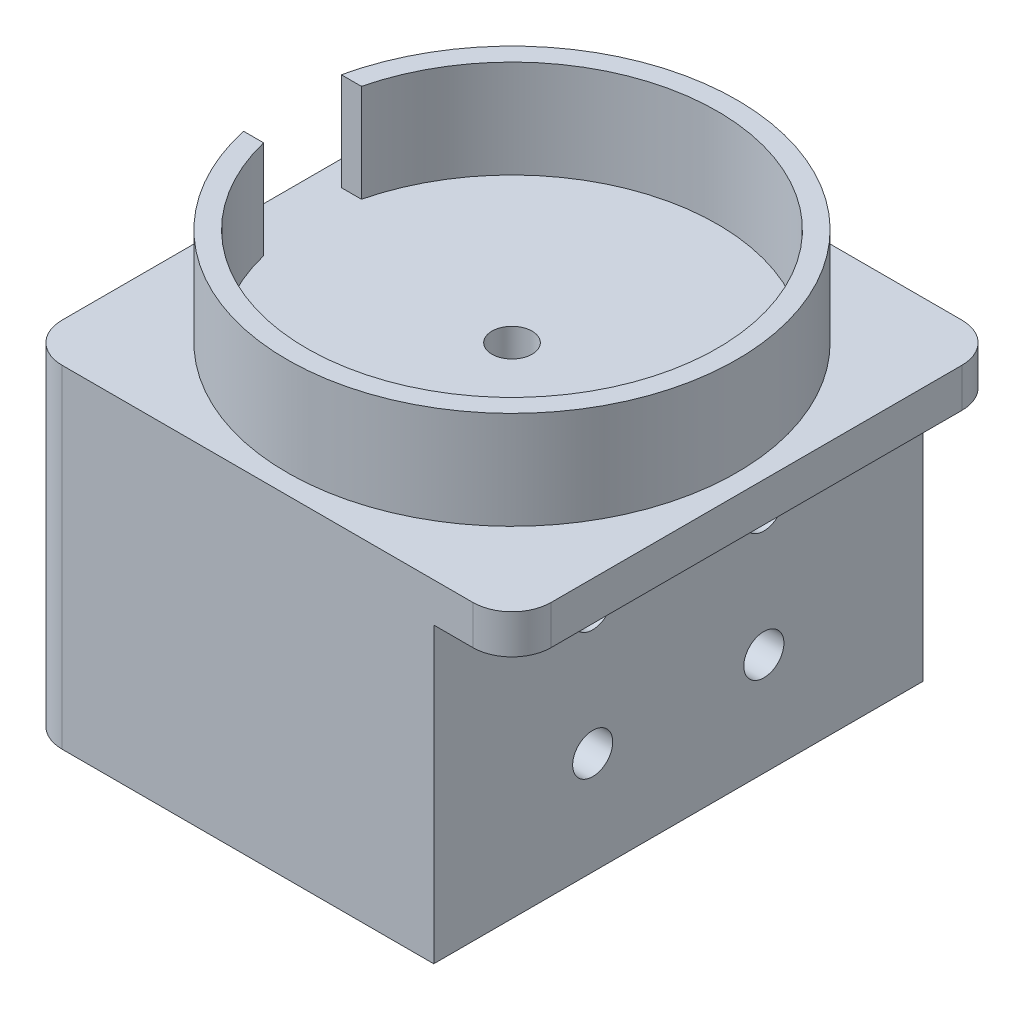
ISO-10303-21;
HEADER;
FILE_DESCRIPTION(('STEP AP214'),'2;1');
FILE_NAME('part.step','',(''),(''),'','','');
FILE_SCHEMA(('AUTOMOTIVE_DESIGN { 1 0 10303 214 1 1 1 1 }'));
ENDSEC;
DATA;
#1=APPLICATION_CONTEXT('core data for automotive mechanical design processes');
#2=APPLICATION_PROTOCOL_DEFINITION('international standard','automotive_design',2000,#1);
#3=PRODUCT_CONTEXT('',#1,'mechanical');
#4=PRODUCT('Part','Part','',(#3));
#5=PRODUCT_RELATED_PRODUCT_CATEGORY('part','',(#4));
#6=PRODUCT_DEFINITION_FORMATION('','',#4);
#7=PRODUCT_DEFINITION_CONTEXT('part definition',#1,'design');
#8=PRODUCT_DEFINITION('design','',#6,#7);
#9=PRODUCT_DEFINITION_SHAPE('','',#8);
#10=(LENGTH_UNIT() NAMED_UNIT(*) SI_UNIT(.MILLI.,.METRE.));
#11=(NAMED_UNIT(*) PLANE_ANGLE_UNIT() SI_UNIT($,.RADIAN.));
#12=(NAMED_UNIT(*) SI_UNIT($,.STERADIAN.) SOLID_ANGLE_UNIT());
#13=UNCERTAINTY_MEASURE_WITH_UNIT(LENGTH_MEASURE(1.E-05),#10,'distance_accuracy_value','');
#14=(GEOMETRIC_REPRESENTATION_CONTEXT(3) GLOBAL_UNCERTAINTY_ASSIGNED_CONTEXT((#13)) GLOBAL_UNIT_ASSIGNED_CONTEXT((#10,
#11,#12)) REPRESENTATION_CONTEXT('',''));
#15=CARTESIAN_POINT('',(0.,0.,0.));
#16=DIRECTION('',(0.,0.,1.));
#17=DIRECTION('',(1.,0.,0.));
#18=AXIS2_PLACEMENT_3D('',#15,#16,#17);
#19=CARTESIAN_POINT('',(0.,30.,0.));
#20=DIRECTION('',(-1.,0.,0.));
#21=DIRECTION('',(0.,0.,1.));
#22=AXIS2_PLACEMENT_3D('',#19,#20,#21);
#23=PLANE('',#22);
#24=DIRECTION('',(0.,0.,1.));
#25=VECTOR('',#24,1.);
#26=CARTESIAN_POINT('',(0.,34.,-4.00000000000003));
#27=LINE('',#26,#25);
#28=CARTESIAN_POINT('',(0.,34.,-46.));
#29=VERTEX_POINT('',#28);
#30=CARTESIAN_POINT('',(0.,34.,-4.00000000000003));
#31=VERTEX_POINT('',#30);
#32=EDGE_CURVE('E225',#29,#31,#27,.T.);
#33=ORIENTED_EDGE('',*,*,#32,.F.);
#34=DIRECTION('',(0.,-1.,0.));
#35=VECTOR('',#34,1.);
#36=CARTESIAN_POINT('',(0.,30.,-46.));
#37=LINE('',#36,#35);
#38=CARTESIAN_POINT('',(0.,0.,-46.));
#39=VERTEX_POINT('',#38);
#40=EDGE_CURVE('E11',#29,#39,#37,.T.);
#41=ORIENTED_EDGE('',*,*,#40,.T.);
#42=DIRECTION('',(0.,0.,-1.));
#43=VECTOR('',#42,1.);
#44=CARTESIAN_POINT('',(0.,0.,0.));
#45=LINE('',#44,#43);
#46=CARTESIAN_POINT('',(0.,0.,-4.00000000000003));
#47=VERTEX_POINT('',#46);
#48=EDGE_CURVE('E201',#47,#39,#45,.T.);
#49=ORIENTED_EDGE('',*,*,#48,.F.);
#50=DIRECTION('',(0.,-1.,0.));
#51=VECTOR('',#50,1.);
#52=CARTESIAN_POINT('',(0.,30.,-4.00000000000003));
#53=LINE('',#52,#51);
#54=EDGE_CURVE('E49',#31,#47,#53,.T.);
#55=ORIENTED_EDGE('',*,*,#54,.F.);
#56=EDGE_LOOP('',(#33,#41,#49,#55));
#57=FACE_BOUND('',#56,.T.);
#58=DIRECTION('',(0.,0.,1.));
#59=VECTOR('',#58,1.);
#60=CARTESIAN_POINT('',(0.,4.,-42.5));
#61=LINE('',#60,#59);
#62=CARTESIAN_POINT('',(0.,4.,-42.5));
#63=VERTEX_POINT('',#62);
#64=CARTESIAN_POINT('',(0.,4.,-7.5));
#65=VERTEX_POINT('',#64);
#66=EDGE_CURVE('E195',#63,#65,#61,.T.);
#67=ORIENTED_EDGE('',*,*,#66,.F.);
#68=DIRECTION('',(0.,-1.,0.));
#69=VECTOR('',#68,1.);
#70=CARTESIAN_POINT('',(0.,4.,-42.5));
#71=LINE('',#70,#69);
#72=CARTESIAN_POINT('',(0.,30.,-42.5));
#73=VERTEX_POINT('',#72);
#74=EDGE_CURVE('E175',#73,#63,#71,.T.);
#75=ORIENTED_EDGE('',*,*,#74,.F.);
#76=DIRECTION('',(0.,0.,1.));
#77=VECTOR('',#76,1.);
#78=CARTESIAN_POINT('',(0.,30.,-4.00000000000003));
#79=LINE('',#78,#77);
#80=CARTESIAN_POINT('',(0.,30.,-7.5));
#81=VERTEX_POINT('',#80);
#82=EDGE_CURVE('E265',#73,#81,#79,.T.);
#83=ORIENTED_EDGE('',*,*,#82,.T.);
#84=DIRECTION('',(0.,-1.,0.));
#85=VECTOR('',#84,1.);
#86=CARTESIAN_POINT('',(0.,4.,-7.5));
#87=LINE('',#86,#85);
#88=EDGE_CURVE('E187',#81,#65,#87,.T.);
#89=ORIENTED_EDGE('',*,*,#88,.T.);
#90=EDGE_LOOP('',(#67,#75,#83,#89));
#91=FACE_BOUND('',#90,.T.);
#92=ADVANCED_FACE('F40',(#57,#91),#23,.T.);
#93=CARTESIAN_POINT('',(4.,30.,-46.));
#94=DIRECTION('',(0.,-1.,0.));
#95=DIRECTION('',(0.,0.,-1.));
#96=AXIS2_PLACEMENT_3D('',#93,#94,#95);
#97=CYLINDRICAL_SURFACE('',#96,4.);
#98=CARTESIAN_POINT('',(4.,0.,-46.));
#99=DIRECTION('',(0.,1.,0.));
#100=DIRECTION('',(0.,0.,1.));
#101=AXIS2_PLACEMENT_3D('',#98,#99,#100);
#102=CIRCLE('',#101,4.);
#103=CARTESIAN_POINT('',(4.00000000000003,0.,-50.));
#104=VERTEX_POINT('',#103);
#105=EDGE_CURVE('E118',#39,#104,#102,.F.);
#106=ORIENTED_EDGE('',*,*,#105,.F.);
#107=ORIENTED_EDGE('',*,*,#40,.F.);
#108=CARTESIAN_POINT('',(4.,34.,-46.));
#109=DIRECTION('',(0.,1.,0.));
#110=DIRECTION('',(0.,0.,-1.));
#111=AXIS2_PLACEMENT_3D('',#108,#109,#110);
#112=CIRCLE('',#111,4.);
#113=CARTESIAN_POINT('',(4.00000000000003,34.,-50.));
#114=VERTEX_POINT('',#113);
#115=EDGE_CURVE('E230',#114,#29,#112,.T.);
#116=ORIENTED_EDGE('',*,*,#115,.F.);
#117=DIRECTION('',(0.,-1.,0.));
#118=VECTOR('',#117,1.);
#119=CARTESIAN_POINT('',(4.00000000000003,30.,-50.));
#120=LINE('',#119,#118);
#121=EDGE_CURVE('E104',#114,#104,#120,.T.);
#122=ORIENTED_EDGE('',*,*,#121,.T.);
#123=EDGE_LOOP('',(#106,#107,#116,#122));
#124=FACE_BOUND('',#123,.T.);
#125=ADVANCED_FACE('F42',(#124),#97,.T.);
#126=CARTESIAN_POINT('',(4.,30.,-4.));
#127=DIRECTION('',(0.,-1.,0.));
#128=DIRECTION('',(0.,0.,-1.));
#129=AXIS2_PLACEMENT_3D('',#126,#127,#128);
#130=CYLINDRICAL_SURFACE('',#129,4.);
#131=CARTESIAN_POINT('',(4.,0.,-4.));
#132=DIRECTION('',(0.,1.,0.));
#133=DIRECTION('',(0.,0.,1.));
#134=AXIS2_PLACEMENT_3D('',#131,#132,#133);
#135=CIRCLE('',#134,4.);
#136=CARTESIAN_POINT('',(4.00000000000003,0.,0.));
#137=VERTEX_POINT('',#136);
#138=EDGE_CURVE('E203',#137,#47,#135,.F.);
#139=ORIENTED_EDGE('',*,*,#138,.F.);
#140=DIRECTION('',(0.,-1.,0.));
#141=VECTOR('',#140,1.);
#142=CARTESIAN_POINT('',(4.00000000000003,30.,0.));
#143=LINE('',#142,#141);
#144=CARTESIAN_POINT('',(4.00000000000003,34.,0.));
#145=VERTEX_POINT('',#144);
#146=EDGE_CURVE('E126',#145,#137,#143,.T.);
#147=ORIENTED_EDGE('',*,*,#146,.F.);
#148=CARTESIAN_POINT('',(4.,34.,-4.));
#149=DIRECTION('',(0.,1.,0.));
#150=DIRECTION('',(0.,0.,-1.));
#151=AXIS2_PLACEMENT_3D('',#148,#149,#150);
#152=CIRCLE('',#151,4.);
#153=EDGE_CURVE('E218',#31,#145,#152,.T.);
#154=ORIENTED_EDGE('',*,*,#153,.F.);
#155=ORIENTED_EDGE('',*,*,#54,.T.);
#156=EDGE_LOOP('',(#139,#147,#154,#155));
#157=FACE_BOUND('',#156,.T.);
#158=ADVANCED_FACE('F211',(#157),#130,.T.);
#159=CARTESIAN_POINT('',(0.,30.,0.));
#160=DIRECTION('',(0.,0.,-1.));
#161=DIRECTION('',(-1.,0.,0.));
#162=AXIS2_PLACEMENT_3D('',#159,#160,#161);
#163=PLANE('',#162);
#164=DIRECTION('',(1.,0.,0.));
#165=VECTOR('',#164,1.);
#166=CARTESIAN_POINT('',(0.,0.,0.));
#167=LINE('',#166,#165);
#168=CARTESIAN_POINT('',(42.,0.,0.));
#169=VERTEX_POINT('',#168);
#170=EDGE_CURVE('E112',#137,#169,#167,.T.);
#171=ORIENTED_EDGE('',*,*,#170,.T.);
#172=DIRECTION('',(0.,-1.,0.));
#173=VECTOR('',#172,1.);
#174=CARTESIAN_POINT('',(42.,30.,0.));
#175=LINE('',#174,#173);
#176=CARTESIAN_POINT('',(42.,30.,0.));
#177=VERTEX_POINT('',#176);
#178=EDGE_CURVE('E103',#177,#169,#175,.T.);
#179=ORIENTED_EDGE('',*,*,#178,.F.);
#180=DIRECTION('',(1.,0.,0.));
#181=VECTOR('',#180,1.);
#182=CARTESIAN_POINT('',(4.00000000000003,30.,0.));
#183=LINE('',#182,#181);
#184=CARTESIAN_POINT('',(46.,30.,0.));
#185=VERTEX_POINT('',#184);
#186=EDGE_CURVE('E66',#177,#185,#183,.T.);
#187=ORIENTED_EDGE('',*,*,#186,.T.);
#188=DIRECTION('',(0.,-1.,0.));
#189=VECTOR('',#188,1.);
#190=CARTESIAN_POINT('',(46.,34.,0.));
#191=LINE('',#190,#189);
#192=CARTESIAN_POINT('',(46.,34.,0.));
#193=VERTEX_POINT('',#192);
#194=EDGE_CURVE('E279',#193,#185,#191,.T.);
#195=ORIENTED_EDGE('',*,*,#194,.F.);
#196=DIRECTION('',(1.,0.,0.));
#197=VECTOR('',#196,1.);
#198=CARTESIAN_POINT('',(4.00000000000003,34.,0.));
#199=LINE('',#198,#197);
#200=EDGE_CURVE('E251',#145,#193,#199,.T.);
#201=ORIENTED_EDGE('',*,*,#200,.F.);
#202=ORIENTED_EDGE('',*,*,#146,.T.);
#203=EDGE_LOOP('',(#171,#179,#187,#195,#201,#202));
#204=FACE_BOUND('',#203,.T.);
#205=ADVANCED_FACE('F206',(#204),#163,.F.);
#206=CARTESIAN_POINT('',(42.,30.,0.));
#207=DIRECTION('',(1.,0.,0.));
#208=DIRECTION('',(0.,0.,-1.));
#209=AXIS2_PLACEMENT_3D('',#206,#207,#208);
#210=PLANE('',#209);
#211=CARTESIAN_POINT('',(42.,23.5,-16.25));
#212=DIRECTION('',(1.,0.,0.));
#213=DIRECTION('',(0.,0.,-1.));
#214=AXIS2_PLACEMENT_3D('',#211,#212,#213);
#215=CIRCLE('',#214,2.05);
#216=CARTESIAN_POINT('',(42.,23.5,-18.3));
#217=VERTEX_POINT('',#216);
#218=EDGE_CURVE('E284',#217,#217,#215,.T.);
#219=ORIENTED_EDGE('',*,*,#218,.F.);
#220=EDGE_LOOP('',(#219));
#221=FACE_BOUND('',#220,.T.);
#222=CARTESIAN_POINT('',(42.,23.5,-33.75));
#223=DIRECTION('',(1.,0.,0.));
#224=DIRECTION('',(0.,0.,-1.));
#225=AXIS2_PLACEMENT_3D('',#222,#223,#224);
#226=CIRCLE('',#225,2.05);
#227=CARTESIAN_POINT('',(42.,23.5,-35.8));
#228=VERTEX_POINT('',#227);
#229=EDGE_CURVE('E287',#228,#228,#226,.T.);
#230=ORIENTED_EDGE('',*,*,#229,.F.);
#231=EDGE_LOOP('',(#230));
#232=FACE_BOUND('',#231,.T.);
#233=CARTESIAN_POINT('',(42.,10.5,-33.75));
#234=DIRECTION('',(1.,0.,0.));
#235=DIRECTION('',(0.,0.,-1.));
#236=AXIS2_PLACEMENT_3D('',#233,#234,#235);
#237=CIRCLE('',#236,2.04999999999999);
#238=CARTESIAN_POINT('',(42.,10.5,-35.8));
#239=VERTEX_POINT('',#238);
#240=EDGE_CURVE('E143',#239,#239,#237,.T.);
#241=ORIENTED_EDGE('',*,*,#240,.F.);
#242=EDGE_LOOP('',(#241));
#243=FACE_BOUND('',#242,.T.);
#244=CARTESIAN_POINT('',(42.,10.5,-16.25));
#245=DIRECTION('',(1.,0.,0.));
#246=DIRECTION('',(0.,0.,-1.));
#247=AXIS2_PLACEMENT_3D('',#244,#245,#246);
#248=CIRCLE('',#247,2.04999999999999);
#249=CARTESIAN_POINT('',(42.,10.5,-18.3));
#250=VERTEX_POINT('',#249);
#251=EDGE_CURVE('E131',#250,#250,#248,.T.);
#252=ORIENTED_EDGE('',*,*,#251,.F.);
#253=EDGE_LOOP('',(#252));
#254=FACE_BOUND('',#253,.T.);
#255=DIRECTION('',(0.,0.,1.));
#256=VECTOR('',#255,1.);
#257=CARTESIAN_POINT('',(42.,0.,0.));
#258=LINE('',#257,#256);
#259=CARTESIAN_POINT('',(42.,0.,-50.));
#260=VERTEX_POINT('',#259);
#261=EDGE_CURVE('E107',#260,#169,#258,.T.);
#262=ORIENTED_EDGE('',*,*,#261,.F.);
#263=DIRECTION('',(0.,-1.,0.));
#264=VECTOR('',#263,1.);
#265=CARTESIAN_POINT('',(42.,30.,-50.));
#266=LINE('',#265,#264);
#267=CARTESIAN_POINT('',(42.,30.,-50.));
#268=VERTEX_POINT('',#267);
#269=EDGE_CURVE('E91',#268,#260,#266,.T.);
#270=ORIENTED_EDGE('',*,*,#269,.F.);
#271=DIRECTION('',(0.,0.,1.));
#272=VECTOR('',#271,1.);
#273=CARTESIAN_POINT('',(42.,30.,0.));
#274=LINE('',#273,#272);
#275=EDGE_CURVE('E119',#268,#177,#274,.T.);
#276=ORIENTED_EDGE('',*,*,#275,.T.);
#277=ORIENTED_EDGE('',*,*,#178,.T.);
#278=EDGE_LOOP('',(#262,#270,#276,#277));
#279=FACE_BOUND('',#278,.T.);
#280=ADVANCED_FACE('F108',(#221,#232,#243,#254,#279),#210,.T.);
#281=CARTESIAN_POINT('',(0.,30.,-50.));
#282=DIRECTION('',(0.,0.,-1.));
#283=DIRECTION('',(-1.,0.,0.));
#284=AXIS2_PLACEMENT_3D('',#281,#282,#283);
#285=PLANE('',#284);
#286=DIRECTION('',(1.,0.,0.));
#287=VECTOR('',#286,1.);
#288=CARTESIAN_POINT('',(0.,0.,-50.));
#289=LINE('',#288,#287);
#290=EDGE_CURVE('E96',#104,#260,#289,.T.);
#291=ORIENTED_EDGE('',*,*,#290,.F.);
#292=ORIENTED_EDGE('',*,*,#121,.F.);
#293=DIRECTION('',(-1.,0.,0.));
#294=VECTOR('',#293,1.);
#295=CARTESIAN_POINT('',(4.00000000000003,34.,-50.));
#296=LINE('',#295,#294);
#297=CARTESIAN_POINT('',(46.,34.,-50.));
#298=VERTEX_POINT('',#297);
#299=EDGE_CURVE('E234',#298,#114,#296,.T.);
#300=ORIENTED_EDGE('',*,*,#299,.F.);
#301=DIRECTION('',(0.,-1.,0.));
#302=VECTOR('',#301,1.);
#303=CARTESIAN_POINT('',(46.,34.,-50.));
#304=LINE('',#303,#302);
#305=CARTESIAN_POINT('',(46.,30.,-50.));
#306=VERTEX_POINT('',#305);
#307=EDGE_CURVE('E282',#298,#306,#304,.T.);
#308=ORIENTED_EDGE('',*,*,#307,.T.);
#309=DIRECTION('',(-1.,0.,0.));
#310=VECTOR('',#309,1.);
#311=CARTESIAN_POINT('',(4.00000000000003,30.,-50.));
#312=LINE('',#311,#310);
#313=EDGE_CURVE('E100',#306,#268,#312,.T.);
#314=ORIENTED_EDGE('',*,*,#313,.T.);
#315=ORIENTED_EDGE('',*,*,#269,.T.);
#316=EDGE_LOOP('',(#291,#292,#300,#308,#314,#315));
#317=FACE_BOUND('',#316,.T.);
#318=ADVANCED_FACE('F93',(#317),#285,.T.);
#319=CARTESIAN_POINT('',(0.,0.,0.));
#320=DIRECTION('',(0.,1.,0.));
#321=DIRECTION('',(0.,0.,1.));
#322=AXIS2_PLACEMENT_3D('',#319,#320,#321);
#323=PLANE('',#322);
#324=CARTESIAN_POINT('',(25.,0.,-35.));
#325=DIRECTION('',(0.,1.,0.));
#326=DIRECTION('',(0.,0.,1.));
#327=AXIS2_PLACEMENT_3D('',#324,#325,#326);
#328=CIRCLE('',#327,2.05);
#329=CARTESIAN_POINT('',(25.,0.,-32.95));
#330=VERTEX_POINT('',#329);
#331=EDGE_CURVE('E135',#330,#330,#328,.T.);
#332=ORIENTED_EDGE('',*,*,#331,.T.);
#333=EDGE_LOOP('',(#332));
#334=FACE_BOUND('',#333,.T.);
#335=CARTESIAN_POINT('',(25.,0.,-25.));
#336=DIRECTION('',(0.,1.,0.));
#337=DIRECTION('',(0.,0.,1.));
#338=AXIS2_PLACEMENT_3D('',#335,#336,#337);
#339=CIRCLE('',#338,2.05);
#340=CARTESIAN_POINT('',(25.,0.,-22.95));
#341=VERTEX_POINT('',#340);
#342=EDGE_CURVE('E152',#341,#341,#339,.T.);
#343=ORIENTED_EDGE('',*,*,#342,.T.);
#344=EDGE_LOOP('',(#343));
#345=FACE_BOUND('',#344,.T.);
#346=CARTESIAN_POINT('',(25.,0.,-15.));
#347=DIRECTION('',(0.,1.,0.));
#348=DIRECTION('',(0.,0.,1.));
#349=AXIS2_PLACEMENT_3D('',#346,#347,#348);
#350=CIRCLE('',#349,2.05);
#351=CARTESIAN_POINT('',(25.,0.,-12.95));
#352=VERTEX_POINT('',#351);
#353=EDGE_CURVE('E158',#352,#352,#350,.T.);
#354=ORIENTED_EDGE('',*,*,#353,.T.);
#355=EDGE_LOOP('',(#354));
#356=FACE_BOUND('',#355,.T.);
#357=CARTESIAN_POINT('',(15.,0.,-25.));
#358=DIRECTION('',(0.,1.,0.));
#359=DIRECTION('',(0.,0.,1.));
#360=AXIS2_PLACEMENT_3D('',#357,#358,#359);
#361=CIRCLE('',#360,2.05);
#362=CARTESIAN_POINT('',(15.,0.,-22.95));
#363=VERTEX_POINT('',#362);
#364=EDGE_CURVE('E164',#363,#363,#361,.T.);
#365=ORIENTED_EDGE('',*,*,#364,.T.);
#366=EDGE_LOOP('',(#365));
#367=FACE_BOUND('',#366,.T.);
#368=ORIENTED_EDGE('',*,*,#105,.T.);
#369=ORIENTED_EDGE('',*,*,#290,.T.);
#370=ORIENTED_EDGE('',*,*,#261,.T.);
#371=ORIENTED_EDGE('',*,*,#170,.F.);
#372=ORIENTED_EDGE('',*,*,#138,.T.);
#373=ORIENTED_EDGE('',*,*,#48,.T.);
#374=EDGE_LOOP('',(#368,#369,#370,#371,#372,#373));
#375=FACE_BOUND('',#374,.T.);
#376=ADVANCED_FACE('F115',(#334,#345,#356,#367,#375),#323,.F.);
#377=CARTESIAN_POINT('',(34.,4.,-42.5));
#378=DIRECTION('',(1.,0.,0.));
#379=DIRECTION('',(0.,0.,-1.));
#380=AXIS2_PLACEMENT_3D('',#377,#378,#379);
#381=PLANE('',#380);
#382=CARTESIAN_POINT('',(34.,23.5,-16.25));
#383=DIRECTION('',(1.,0.,0.));
#384=DIRECTION('',(0.,0.,-1.));
#385=AXIS2_PLACEMENT_3D('',#382,#383,#384);
#386=CIRCLE('',#385,2.04999999999999);
#387=CARTESIAN_POINT('',(34.,23.5,-18.3));
#388=VERTEX_POINT('',#387);
#389=EDGE_CURVE('E44',#388,#388,#386,.T.);
#390=ORIENTED_EDGE('',*,*,#389,.T.);
#391=EDGE_LOOP('',(#390));
#392=FACE_BOUND('',#391,.T.);
#393=CARTESIAN_POINT('',(34.,23.5,-33.75));
#394=DIRECTION('',(1.,0.,0.));
#395=DIRECTION('',(0.,0.,-1.));
#396=AXIS2_PLACEMENT_3D('',#393,#394,#395);
#397=CIRCLE('',#396,2.04999999999999);
#398=CARTESIAN_POINT('',(34.,23.5,-35.8));
#399=VERTEX_POINT('',#398);
#400=EDGE_CURVE('E290',#399,#399,#397,.T.);
#401=ORIENTED_EDGE('',*,*,#400,.T.);
#402=EDGE_LOOP('',(#401));
#403=FACE_BOUND('',#402,.T.);
#404=CARTESIAN_POINT('',(34.,10.5,-33.75));
#405=DIRECTION('',(1.,0.,0.));
#406=DIRECTION('',(0.,0.,-1.));
#407=AXIS2_PLACEMENT_3D('',#404,#405,#406);
#408=CIRCLE('',#407,2.04999999999999);
#409=CARTESIAN_POINT('',(34.,10.5,-35.8));
#410=VERTEX_POINT('',#409);
#411=EDGE_CURVE('E138',#410,#410,#408,.T.);
#412=ORIENTED_EDGE('',*,*,#411,.T.);
#413=EDGE_LOOP('',(#412));
#414=FACE_BOUND('',#413,.T.);
#415=CARTESIAN_POINT('',(34.,10.5,-16.25));
#416=DIRECTION('',(1.,0.,0.));
#417=DIRECTION('',(0.,0.,-1.));
#418=AXIS2_PLACEMENT_3D('',#415,#416,#417);
#419=CIRCLE('',#418,2.04999999999999);
#420=CARTESIAN_POINT('',(34.,10.5,-18.3));
#421=VERTEX_POINT('',#420);
#422=EDGE_CURVE('E128',#421,#421,#419,.T.);
#423=ORIENTED_EDGE('',*,*,#422,.T.);
#424=EDGE_LOOP('',(#423));
#425=FACE_BOUND('',#424,.T.);
#426=DIRECTION('',(0.,1.,0.));
#427=VECTOR('',#426,1.);
#428=CARTESIAN_POINT('',(34.,4.,-7.5));
#429=LINE('',#428,#427);
#430=CARTESIAN_POINT('',(34.,4.,-7.5));
#431=VERTEX_POINT('',#430);
#432=CARTESIAN_POINT('',(34.,30.,-7.5));
#433=VERTEX_POINT('',#432);
#434=EDGE_CURVE('E167',#431,#433,#429,.T.);
#435=ORIENTED_EDGE('',*,*,#434,.T.);
#436=DIRECTION('',(0.,0.,1.));
#437=VECTOR('',#436,1.);
#438=CARTESIAN_POINT('',(34.,30.,-42.5));
#439=LINE('',#438,#437);
#440=CARTESIAN_POINT('',(34.,30.,-42.5));
#441=VERTEX_POINT('',#440);
#442=EDGE_CURVE('E181',#441,#433,#439,.T.);
#443=ORIENTED_EDGE('',*,*,#442,.F.);
#444=DIRECTION('',(0.,1.,0.));
#445=VECTOR('',#444,1.);
#446=CARTESIAN_POINT('',(34.,4.,-42.5));
#447=LINE('',#446,#445);
#448=CARTESIAN_POINT('',(34.,4.,-42.5));
#449=VERTEX_POINT('',#448);
#450=EDGE_CURVE('E168',#449,#441,#447,.T.);
#451=ORIENTED_EDGE('',*,*,#450,.F.);
#452=DIRECTION('',(0.,0.,1.));
#453=VECTOR('',#452,1.);
#454=CARTESIAN_POINT('',(34.,4.,-42.5));
#455=LINE('',#454,#453);
#456=EDGE_CURVE('E192',#449,#431,#455,.T.);
#457=ORIENTED_EDGE('',*,*,#456,.T.);
#458=EDGE_LOOP('',(#435,#443,#451,#457));
#459=FACE_BOUND('',#458,.T.);
#460=ADVANCED_FACE('F344',(#392,#403,#414,#425,#459),#381,.F.);
#461=CARTESIAN_POINT('',(34.,4.,-42.5));
#462=DIRECTION('',(0.,-1.,0.));
#463=DIRECTION('',(1.,0.,0.));
#464=AXIS2_PLACEMENT_3D('',#461,#462,#463);
#465=PLANE('',#464);
#466=CARTESIAN_POINT('',(25.,4.,-35.));
#467=DIRECTION('',(0.,1.,0.));
#468=DIRECTION('',(0.,0.,1.));
#469=AXIS2_PLACEMENT_3D('',#466,#467,#468);
#470=CIRCLE('',#469,2.05);
#471=CARTESIAN_POINT('',(25.,4.,-32.95));
#472=VERTEX_POINT('',#471);
#473=EDGE_CURVE('E130',#472,#472,#470,.T.);
#474=ORIENTED_EDGE('',*,*,#473,.F.);
#475=EDGE_LOOP('',(#474));
#476=FACE_BOUND('',#475,.T.);
#477=CARTESIAN_POINT('',(25.,4.,-25.));
#478=DIRECTION('',(0.,1.,0.));
#479=DIRECTION('',(0.,0.,1.));
#480=AXIS2_PLACEMENT_3D('',#477,#478,#479);
#481=CIRCLE('',#480,2.05);
#482=CARTESIAN_POINT('',(25.,4.,-22.95));
#483=VERTEX_POINT('',#482);
#484=EDGE_CURVE('E149',#483,#483,#481,.T.);
#485=ORIENTED_EDGE('',*,*,#484,.F.);
#486=EDGE_LOOP('',(#485));
#487=FACE_BOUND('',#486,.T.);
#488=CARTESIAN_POINT('',(25.,4.,-15.));
#489=DIRECTION('',(0.,1.,0.));
#490=DIRECTION('',(0.,0.,1.));
#491=AXIS2_PLACEMENT_3D('',#488,#489,#490);
#492=CIRCLE('',#491,2.05);
#493=CARTESIAN_POINT('',(25.,4.,-12.95));
#494=VERTEX_POINT('',#493);
#495=EDGE_CURVE('E155',#494,#494,#492,.T.);
#496=ORIENTED_EDGE('',*,*,#495,.F.);
#497=EDGE_LOOP('',(#496));
#498=FACE_BOUND('',#497,.T.);
#499=CARTESIAN_POINT('',(15.,4.,-25.));
#500=DIRECTION('',(0.,1.,0.));
#501=DIRECTION('',(0.,0.,1.));
#502=AXIS2_PLACEMENT_3D('',#499,#500,#501);
#503=CIRCLE('',#502,2.05);
#504=CARTESIAN_POINT('',(15.,4.,-22.95));
#505=VERTEX_POINT('',#504);
#506=EDGE_CURVE('E161',#505,#505,#503,.T.);
#507=ORIENTED_EDGE('',*,*,#506,.F.);
#508=EDGE_LOOP('',(#507));
#509=FACE_BOUND('',#508,.T.);
#510=DIRECTION('',(1.,0.,0.));
#511=VECTOR('',#510,1.);
#512=CARTESIAN_POINT('',(34.,4.,-7.5));
#513=LINE('',#512,#511);
#514=EDGE_CURVE('E172',#65,#431,#513,.T.);
#515=ORIENTED_EDGE('',*,*,#514,.T.);
#516=ORIENTED_EDGE('',*,*,#456,.F.);
#517=DIRECTION('',(1.,0.,0.));
#518=VECTOR('',#517,1.);
#519=CARTESIAN_POINT('',(34.,4.,-42.5));
#520=LINE('',#519,#518);
#521=EDGE_CURVE('E178',#63,#449,#520,.T.);
#522=ORIENTED_EDGE('',*,*,#521,.F.);
#523=ORIENTED_EDGE('',*,*,#66,.T.);
#524=EDGE_LOOP('',(#515,#516,#522,#523));
#525=FACE_BOUND('',#524,.T.);
#526=ADVANCED_FACE('F349',(#476,#487,#498,#509,#525),#465,.F.);
#527=CARTESIAN_POINT('',(0.,0.,-42.5));
#528=DIRECTION('',(0.,0.,1.));
#529=DIRECTION('',(1.,0.,0.));
#530=AXIS2_PLACEMENT_3D('',#527,#528,#529);
#531=PLANE('',#530);
#532=ORIENTED_EDGE('',*,*,#450,.T.);
#533=DIRECTION('',(-1.,0.,0.));
#534=VECTOR('',#533,1.);
#535=CARTESIAN_POINT('',(34.,30.,-42.5));
#536=LINE('',#535,#534);
#537=EDGE_CURVE('E171',#441,#73,#536,.T.);
#538=ORIENTED_EDGE('',*,*,#537,.T.);
#539=ORIENTED_EDGE('',*,*,#74,.T.);
#540=ORIENTED_EDGE('',*,*,#521,.T.);
#541=EDGE_LOOP('',(#532,#538,#539,#540));
#542=FACE_BOUND('',#541,.T.);
#543=ADVANCED_FACE('F359',(#542),#531,.T.);
#544=CARTESIAN_POINT('',(0.,0.,-7.5));
#545=DIRECTION('',(0.,0.,1.));
#546=DIRECTION('',(1.,0.,0.));
#547=AXIS2_PLACEMENT_3D('',#544,#545,#546);
#548=PLANE('',#547);
#549=ORIENTED_EDGE('',*,*,#434,.F.);
#550=ORIENTED_EDGE('',*,*,#514,.F.);
#551=ORIENTED_EDGE('',*,*,#88,.F.);
#552=DIRECTION('',(-1.,0.,0.));
#553=VECTOR('',#552,1.);
#554=CARTESIAN_POINT('',(34.,30.,-7.5));
#555=LINE('',#554,#553);
#556=EDGE_CURVE('E184',#433,#81,#555,.T.);
#557=ORIENTED_EDGE('',*,*,#556,.F.);
#558=EDGE_LOOP('',(#549,#550,#551,#557));
#559=FACE_BOUND('',#558,.T.);
#560=ADVANCED_FACE('F364',(#559),#548,.F.);
#561=CARTESIAN_POINT('',(15.,4.,-25.));
#562=DIRECTION('',(0.,1.,0.));
#563=DIRECTION('',(0.,0.,1.));
#564=AXIS2_PLACEMENT_3D('',#561,#562,#563);
#565=CYLINDRICAL_SURFACE('',#564,2.05);
#566=ORIENTED_EDGE('',*,*,#364,.F.);
#567=EDGE_LOOP('',(#566));
#568=FACE_BOUND('',#567,.T.);
#569=ORIENTED_EDGE('',*,*,#506,.T.);
#570=EDGE_LOOP('',(#569));
#571=FACE_BOUND('',#570,.T.);
#572=ADVANCED_FACE('F375',(#568,#571),#565,.F.);
#573=CARTESIAN_POINT('',(25.,4.,-15.));
#574=DIRECTION('',(0.,1.,0.));
#575=DIRECTION('',(0.,0.,1.));
#576=AXIS2_PLACEMENT_3D('',#573,#574,#575);
#577=CYLINDRICAL_SURFACE('',#576,2.05);
#578=ORIENTED_EDGE('',*,*,#353,.F.);
#579=EDGE_LOOP('',(#578));
#580=FACE_BOUND('',#579,.T.);
#581=ORIENTED_EDGE('',*,*,#495,.T.);
#582=EDGE_LOOP('',(#581));
#583=FACE_BOUND('',#582,.T.);
#584=ADVANCED_FACE('F576',(#580,#583),#577,.F.);
#585=CARTESIAN_POINT('',(25.,4.,-25.));
#586=DIRECTION('',(0.,1.,0.));
#587=DIRECTION('',(0.,0.,1.));
#588=AXIS2_PLACEMENT_3D('',#585,#586,#587);
#589=CYLINDRICAL_SURFACE('',#588,2.05);
#590=ORIENTED_EDGE('',*,*,#342,.F.);
#591=EDGE_LOOP('',(#590));
#592=FACE_BOUND('',#591,.T.);
#593=ORIENTED_EDGE('',*,*,#484,.T.);
#594=EDGE_LOOP('',(#593));
#595=FACE_BOUND('',#594,.T.);
#596=ADVANCED_FACE('F566',(#592,#595),#589,.F.);
#597=CARTESIAN_POINT('',(25.,4.,-35.));
#598=DIRECTION('',(0.,1.,0.));
#599=DIRECTION('',(0.,0.,1.));
#600=AXIS2_PLACEMENT_3D('',#597,#598,#599);
#601=CYLINDRICAL_SURFACE('',#600,2.05);
#602=ORIENTED_EDGE('',*,*,#331,.F.);
#603=EDGE_LOOP('',(#602));
#604=FACE_BOUND('',#603,.T.);
#605=ORIENTED_EDGE('',*,*,#473,.T.);
#606=EDGE_LOOP('',(#605));
#607=FACE_BOUND('',#606,.T.);
#608=ADVANCED_FACE('F557',(#604,#607),#601,.F.);
#609=CARTESIAN_POINT('',(42.,10.5,-16.25));
#610=DIRECTION('',(1.,0.,0.));
#611=DIRECTION('',(0.,0.,-1.));
#612=AXIS2_PLACEMENT_3D('',#609,#610,#611);
#613=CYLINDRICAL_SURFACE('',#612,2.04999999999999);
#614=ORIENTED_EDGE('',*,*,#251,.T.);
#615=EDGE_LOOP('',(#614));
#616=FACE_BOUND('',#615,.T.);
#617=ORIENTED_EDGE('',*,*,#422,.F.);
#618=EDGE_LOOP('',(#617));
#619=FACE_BOUND('',#618,.T.);
#620=ADVANCED_FACE('F548',(#616,#619),#613,.F.);
#621=CARTESIAN_POINT('',(42.,10.5,-33.75));
#622=DIRECTION('',(1.,0.,0.));
#623=DIRECTION('',(0.,0.,-1.));
#624=AXIS2_PLACEMENT_3D('',#621,#622,#623);
#625=CYLINDRICAL_SURFACE('',#624,2.04999999999999);
#626=ORIENTED_EDGE('',*,*,#240,.T.);
#627=EDGE_LOOP('',(#626));
#628=FACE_BOUND('',#627,.T.);
#629=ORIENTED_EDGE('',*,*,#411,.F.);
#630=EDGE_LOOP('',(#629));
#631=FACE_BOUND('',#630,.T.);
#632=ADVANCED_FACE('F295',(#628,#631),#625,.F.);
#633=CARTESIAN_POINT('',(42.,23.5,-33.75));
#634=DIRECTION('',(1.,0.,0.));
#635=DIRECTION('',(0.,0.,-1.));
#636=AXIS2_PLACEMENT_3D('',#633,#634,#635);
#637=CYLINDRICAL_SURFACE('',#636,2.04999999999999);
#638=ORIENTED_EDGE('',*,*,#229,.T.);
#639=EDGE_LOOP('',(#638));
#640=FACE_BOUND('',#639,.T.);
#641=ORIENTED_EDGE('',*,*,#400,.F.);
#642=EDGE_LOOP('',(#641));
#643=FACE_BOUND('',#642,.T.);
#644=ADVANCED_FACE('F528',(#640,#643),#637,.F.);
#645=CARTESIAN_POINT('',(42.,23.5,-16.25));
#646=DIRECTION('',(1.,0.,0.));
#647=DIRECTION('',(0.,0.,-1.));
#648=AXIS2_PLACEMENT_3D('',#645,#646,#647);
#649=CYLINDRICAL_SURFACE('',#648,2.04999999999999);
#650=ORIENTED_EDGE('',*,*,#218,.T.);
#651=EDGE_LOOP('',(#650));
#652=FACE_BOUND('',#651,.T.);
#653=ORIENTED_EDGE('',*,*,#389,.F.);
#654=EDGE_LOOP('',(#653));
#655=FACE_BOUND('',#654,.T.);
#656=ADVANCED_FACE('F490',(#652,#655),#649,.F.);
#657=CARTESIAN_POINT('',(46.,30.,-46.));
#658=DIRECTION('',(0.,-1.,0.));
#659=DIRECTION('',(0.,0.,-1.));
#660=AXIS2_PLACEMENT_3D('',#657,#658,#659);
#661=PLANE('',#660);
#662=CARTESIAN_POINT('',(25.,30.,-25.));
#663=DIRECTION('',(0.,-1.,0.));
#664=DIRECTION('',(0.,0.,-1.));
#665=AXIS2_PLACEMENT_3D('',#662,#663,#664);
#666=CIRCLE('',#665,2.05);
#667=CARTESIAN_POINT('',(25.,30.,-27.05));
#668=VERTEX_POINT('',#667);
#669=EDGE_CURVE('E780',#668,#668,#666,.T.);
#670=ORIENTED_EDGE('',*,*,#669,.F.);
#671=EDGE_LOOP('',(#670));
#672=FACE_BOUND('',#671,.T.);
#673=ORIENTED_EDGE('',*,*,#537,.F.);
#674=ORIENTED_EDGE('',*,*,#442,.T.);
#675=ORIENTED_EDGE('',*,*,#556,.T.);
#676=ORIENTED_EDGE('',*,*,#82,.F.);
#677=EDGE_LOOP('',(#673,#674,#675,#676));
#678=FACE_BOUND('',#677,.T.);
#679=ADVANCED_FACE('F390',(#672,#678),#661,.T.);
#680=ORIENTED_EDGE('',*,*,#275,.F.);
#681=ORIENTED_EDGE('',*,*,#313,.F.);
#682=CARTESIAN_POINT('',(46.,30.,-46.));
#683=DIRECTION('',(0.,1.,0.));
#684=DIRECTION('',(0.,0.,-1.));
#685=AXIS2_PLACEMENT_3D('',#682,#683,#684);
#686=CIRCLE('',#685,4.);
#687=CARTESIAN_POINT('',(50.,30.,-46.));
#688=VERTEX_POINT('',#687);
#689=EDGE_CURVE('E260',#688,#306,#686,.T.);
#690=ORIENTED_EDGE('',*,*,#689,.F.);
#691=DIRECTION('',(0.,0.,-1.));
#692=VECTOR('',#691,1.);
#693=CARTESIAN_POINT('',(50.,30.,-4.00000000000003));
#694=LINE('',#693,#692);
#695=CARTESIAN_POINT('',(50.,30.,-4.00000000000003));
#696=VERTEX_POINT('',#695);
#697=EDGE_CURVE('E245',#696,#688,#694,.T.);
#698=ORIENTED_EDGE('',*,*,#697,.F.);
#699=CARTESIAN_POINT('',(46.,30.,-4.));
#700=DIRECTION('',(0.,1.,0.));
#701=DIRECTION('',(0.,0.,1.));
#702=AXIS2_PLACEMENT_3D('',#699,#700,#701);
#703=CIRCLE('',#702,4.);
#704=EDGE_CURVE('E269',#185,#696,#703,.T.);
#705=ORIENTED_EDGE('',*,*,#704,.F.);
#706=ORIENTED_EDGE('',*,*,#186,.F.);
#707=EDGE_LOOP('',(#680,#681,#690,#698,#705,#706));
#708=FACE_BOUND('',#707,.T.);
#709=ADVANCED_FACE('F384',(#708),#661,.T.);
#710=CARTESIAN_POINT('',(46.,34.,-46.));
#711=DIRECTION('',(0.,-1.,0.));
#712=DIRECTION('',(0.,0.,-1.));
#713=AXIS2_PLACEMENT_3D('',#710,#711,#712);
#714=CYLINDRICAL_SURFACE('',#713,4.);
#715=ORIENTED_EDGE('',*,*,#689,.T.);
#716=ORIENTED_EDGE('',*,*,#307,.F.);
#717=CARTESIAN_POINT('',(46.,34.,-46.));
#718=DIRECTION('',(0.,1.,0.));
#719=DIRECTION('',(0.,0.,-1.));
#720=AXIS2_PLACEMENT_3D('',#717,#718,#719);
#721=CIRCLE('',#720,4.);
#722=CARTESIAN_POINT('',(50.,34.,-46.));
#723=VERTEX_POINT('',#722);
#724=EDGE_CURVE('E241',#723,#298,#721,.T.);
#725=ORIENTED_EDGE('',*,*,#724,.F.);
#726=DIRECTION('',(0.,-1.,0.));
#727=VECTOR('',#726,1.);
#728=CARTESIAN_POINT('',(50.,34.,-46.));
#729=LINE('',#728,#727);
#730=EDGE_CURVE('E259',#723,#688,#729,.T.);
#731=ORIENTED_EDGE('',*,*,#730,.T.);
#732=EDGE_LOOP('',(#715,#716,#725,#731));
#733=FACE_BOUND('',#732,.T.);
#734=ADVANCED_FACE('F389',(#733),#714,.T.);
#735=CARTESIAN_POINT('',(46.,34.,-4.));
#736=DIRECTION('',(0.,-1.,0.));
#737=DIRECTION('',(0.,0.,-1.));
#738=AXIS2_PLACEMENT_3D('',#735,#736,#737);
#739=CYLINDRICAL_SURFACE('',#738,4.);
#740=ORIENTED_EDGE('',*,*,#704,.T.);
#741=DIRECTION('',(0.,-1.,0.));
#742=VECTOR('',#741,1.);
#743=CARTESIAN_POINT('',(50.,34.,-4.00000000000003));
#744=LINE('',#743,#742);
#745=CARTESIAN_POINT('',(50.,34.,-4.00000000000003));
#746=VERTEX_POINT('',#745);
#747=EDGE_CURVE('E276',#746,#696,#744,.T.);
#748=ORIENTED_EDGE('',*,*,#747,.F.);
#749=CARTESIAN_POINT('',(46.,34.,-4.));
#750=DIRECTION('',(0.,1.,0.));
#751=DIRECTION('',(0.,0.,1.));
#752=AXIS2_PLACEMENT_3D('',#749,#750,#751);
#753=CIRCLE('',#752,4.);
#754=EDGE_CURVE('E254',#193,#746,#753,.T.);
#755=ORIENTED_EDGE('',*,*,#754,.F.);
#756=ORIENTED_EDGE('',*,*,#194,.T.);
#757=EDGE_LOOP('',(#740,#748,#755,#756));
#758=FACE_BOUND('',#757,.T.);
#759=ADVANCED_FACE('F401',(#758),#739,.T.);
#760=CARTESIAN_POINT('',(50.,34.,-4.00000000000003));
#761=DIRECTION('',(-1.,0.,0.));
#762=DIRECTION('',(0.,0.,1.));
#763=AXIS2_PLACEMENT_3D('',#760,#761,#762);
#764=PLANE('',#763);
#765=ORIENTED_EDGE('',*,*,#697,.T.);
#766=ORIENTED_EDGE('',*,*,#730,.F.);
#767=DIRECTION('',(0.,0.,-1.));
#768=VECTOR('',#767,1.);
#769=CARTESIAN_POINT('',(50.,34.,-4.00000000000003));
#770=LINE('',#769,#768);
#771=EDGE_CURVE('E257',#746,#723,#770,.T.);
#772=ORIENTED_EDGE('',*,*,#771,.F.);
#773=ORIENTED_EDGE('',*,*,#747,.T.);
#774=EDGE_LOOP('',(#765,#766,#772,#773));
#775=FACE_BOUND('',#774,.T.);
#776=ADVANCED_FACE('F412',(#775),#764,.F.);
#777=CARTESIAN_POINT('',(46.,34.,-46.));
#778=DIRECTION('',(0.,-1.,0.));
#779=DIRECTION('',(0.,0.,-1.));
#780=AXIS2_PLACEMENT_3D('',#777,#778,#779);
#781=PLANE('',#780);
#782=CARTESIAN_POINT('',(25.,34.,-25.));
#783=DIRECTION('',(0.,-1.,0.));
#784=DIRECTION('',(0.,0.,-1.));
#785=AXIS2_PLACEMENT_3D('',#782,#783,#784);
#786=CIRCLE('',#785,2.05);
#787=CARTESIAN_POINT('',(25.,34.,-27.05));
#788=VERTEX_POINT('',#787);
#789=EDGE_CURVE('E775',#788,#788,#786,.T.);
#790=ORIENTED_EDGE('',*,*,#789,.T.);
#791=EDGE_LOOP('',(#790));
#792=FACE_BOUND('',#791,.T.);
#793=DIRECTION('',(-1.,0.,0.));
#794=VECTOR('',#793,1.);
#795=CARTESIAN_POINT('',(0.,34.,-20.));
#796=LINE('',#795,#794);
#797=CARTESIAN_POINT('',(4.60392194562886,34.,-20.));
#798=VERTEX_POINT('',#797);
#799=CARTESIAN_POINT('',(2.55005567935635,34.,-20.));
#800=VERTEX_POINT('',#799);
#801=EDGE_CURVE('E761',#798,#800,#796,.T.);
#802=ORIENTED_EDGE('',*,*,#801,.F.);
#803=CARTESIAN_POINT('',(25.,34.,-25.));
#804=DIRECTION('',(0.,1.,0.));
#805=DIRECTION('',(0.,0.,1.));
#806=AXIS2_PLACEMENT_3D('',#803,#804,#805);
#807=CIRCLE('',#806,21.);
#808=CARTESIAN_POINT('',(4.60392194562887,34.,-30.));
#809=VERTEX_POINT('',#808);
#810=EDGE_CURVE('E758',#798,#809,#807,.T.);
#811=ORIENTED_EDGE('',*,*,#810,.T.);
#812=DIRECTION('',(1.,0.,0.));
#813=VECTOR('',#812,1.);
#814=CARTESIAN_POINT('',(0.,34.,-30.));
#815=LINE('',#814,#813);
#816=CARTESIAN_POINT('',(2.55005567935635,34.,-30.));
#817=VERTEX_POINT('',#816);
#818=EDGE_CURVE('E57',#817,#809,#815,.T.);
#819=ORIENTED_EDGE('',*,*,#818,.F.);
#820=CARTESIAN_POINT('',(25.,34.,-25.));
#821=DIRECTION('',(0.,1.,0.));
#822=DIRECTION('',(0.,0.,1.));
#823=AXIS2_PLACEMENT_3D('',#820,#821,#822);
#824=CIRCLE('',#823,23.);
#825=EDGE_CURVE('E772',#800,#817,#824,.T.);
#826=ORIENTED_EDGE('',*,*,#825,.F.);
#827=EDGE_LOOP('',(#802,#811,#819,#826));
#828=FACE_BOUND('',#827,.T.);
#829=ORIENTED_EDGE('',*,*,#724,.T.);
#830=ORIENTED_EDGE('',*,*,#299,.T.);
#831=ORIENTED_EDGE('',*,*,#115,.T.);
#832=ORIENTED_EDGE('',*,*,#32,.T.);
#833=ORIENTED_EDGE('',*,*,#153,.T.);
#834=ORIENTED_EDGE('',*,*,#200,.T.);
#835=ORIENTED_EDGE('',*,*,#754,.T.);
#836=ORIENTED_EDGE('',*,*,#771,.T.);
#837=EDGE_LOOP('',(#829,#830,#831,#832,#833,#834,#835,#836));
#838=FACE_BOUND('',#837,.T.);
#839=ADVANCED_FACE('F238',(#792,#828,#838),#781,.F.);
#840=CARTESIAN_POINT('',(0.,44.,-20.));
#841=DIRECTION('',(0.,0.,1.));
#842=DIRECTION('',(1.,0.,0.));
#843=AXIS2_PLACEMENT_3D('',#840,#841,#842);
#844=PLANE('',#843);
#845=ORIENTED_EDGE('',*,*,#801,.T.);
#846=DIRECTION('',(0.,-1.,0.));
#847=VECTOR('',#846,1.);
#848=CARTESIAN_POINT('',(2.55005567935635,44.,-20.));
#849=LINE('',#848,#847);
#850=CARTESIAN_POINT('',(2.55005567935635,44.,-20.));
#851=VERTEX_POINT('',#850);
#852=EDGE_CURVE('E263',#851,#800,#849,.T.);
#853=ORIENTED_EDGE('',*,*,#852,.F.);
#854=DIRECTION('',(-1.,0.,0.));
#855=VECTOR('',#854,1.);
#856=CARTESIAN_POINT('',(0.,44.,-20.));
#857=LINE('',#856,#855);
#858=CARTESIAN_POINT('',(4.60392194562886,44.,-20.));
#859=VERTEX_POINT('',#858);
#860=EDGE_CURVE('E752',#859,#851,#857,.T.);
#861=ORIENTED_EDGE('',*,*,#860,.F.);
#862=DIRECTION('',(0.,-1.,0.));
#863=VECTOR('',#862,1.);
#864=CARTESIAN_POINT('',(4.60392194562886,44.,-20.));
#865=LINE('',#864,#863);
#866=EDGE_CURVE('E767',#859,#798,#865,.T.);
#867=ORIENTED_EDGE('',*,*,#866,.T.);
#868=EDGE_LOOP('',(#845,#853,#861,#867));
#869=FACE_BOUND('',#868,.T.);
#870=ADVANCED_FACE('F431',(#869),#844,.F.);
#871=CARTESIAN_POINT('',(25.,44.,-25.));
#872=DIRECTION('',(0.,-1.,0.));
#873=DIRECTION('',(0.,0.,-1.));
#874=AXIS2_PLACEMENT_3D('',#871,#872,#873);
#875=CYLINDRICAL_SURFACE('',#874,23.);
#876=ORIENTED_EDGE('',*,*,#825,.T.);
#877=DIRECTION('',(0.,-1.,0.));
#878=VECTOR('',#877,1.);
#879=CARTESIAN_POINT('',(2.55005567935635,44.,-30.));
#880=LINE('',#879,#878);
#881=CARTESIAN_POINT('',(2.55005567935635,44.,-30.));
#882=VERTEX_POINT('',#881);
#883=EDGE_CURVE('E749',#882,#817,#880,.T.);
#884=ORIENTED_EDGE('',*,*,#883,.F.);
#885=CARTESIAN_POINT('',(25.,44.,-25.));
#886=DIRECTION('',(0.,1.,0.));
#887=DIRECTION('',(0.,0.,1.));
#888=AXIS2_PLACEMENT_3D('',#885,#886,#887);
#889=CIRCLE('',#888,23.);
#890=EDGE_CURVE('E745',#851,#882,#889,.T.);
#891=ORIENTED_EDGE('',*,*,#890,.F.);
#892=ORIENTED_EDGE('',*,*,#852,.T.);
#893=EDGE_LOOP('',(#876,#884,#891,#892));
#894=FACE_BOUND('',#893,.T.);
#895=ADVANCED_FACE('F436',(#894),#875,.T.);
#896=CARTESIAN_POINT('',(0.,44.,-30.));
#897=DIRECTION('',(0.,0.,-1.));
#898=DIRECTION('',(-1.,0.,0.));
#899=AXIS2_PLACEMENT_3D('',#896,#897,#898);
#900=PLANE('',#899);
#901=ORIENTED_EDGE('',*,*,#818,.T.);
#902=DIRECTION('',(0.,-1.,0.));
#903=VECTOR('',#902,1.);
#904=CARTESIAN_POINT('',(4.60392194562886,44.,-30.));
#905=LINE('',#904,#903);
#906=CARTESIAN_POINT('',(4.60392194562886,44.,-30.));
#907=VERTEX_POINT('',#906);
#908=EDGE_CURVE('E763',#907,#809,#905,.T.);
#909=ORIENTED_EDGE('',*,*,#908,.F.);
#910=DIRECTION('',(1.,0.,0.));
#911=VECTOR('',#910,1.);
#912=CARTESIAN_POINT('',(0.,44.,-30.));
#913=LINE('',#912,#911);
#914=EDGE_CURVE('E751',#882,#907,#913,.T.);
#915=ORIENTED_EDGE('',*,*,#914,.F.);
#916=ORIENTED_EDGE('',*,*,#883,.T.);
#917=EDGE_LOOP('',(#901,#909,#915,#916));
#918=FACE_BOUND('',#917,.T.);
#919=ADVANCED_FACE('F447',(#918),#900,.F.);
#920=CARTESIAN_POINT('',(25.,44.,-25.));
#921=DIRECTION('',(0.,-1.,0.));
#922=DIRECTION('',(0.,0.,-1.));
#923=AXIS2_PLACEMENT_3D('',#920,#921,#922);
#924=CYLINDRICAL_SURFACE('',#923,21.);
#925=ORIENTED_EDGE('',*,*,#810,.F.);
#926=ORIENTED_EDGE('',*,*,#866,.F.);
#927=CARTESIAN_POINT('',(25.,44.,-25.));
#928=DIRECTION('',(0.,1.,0.));
#929=DIRECTION('',(0.,0.,1.));
#930=AXIS2_PLACEMENT_3D('',#927,#928,#929);
#931=CIRCLE('',#930,21.);
#932=EDGE_CURVE('E757',#859,#907,#931,.T.);
#933=ORIENTED_EDGE('',*,*,#932,.T.);
#934=ORIENTED_EDGE('',*,*,#908,.T.);
#935=EDGE_LOOP('',(#925,#926,#933,#934));
#936=FACE_BOUND('',#935,.T.);
#937=ADVANCED_FACE('F458',(#936),#924,.F.);
#938=CARTESIAN_POINT('',(0.,44.,0.));
#939=DIRECTION('',(0.,1.,0.));
#940=DIRECTION('',(0.,0.,1.));
#941=AXIS2_PLACEMENT_3D('',#938,#939,#940);
#942=PLANE('',#941);
#943=ORIENTED_EDGE('',*,*,#860,.T.);
#944=ORIENTED_EDGE('',*,*,#890,.T.);
#945=ORIENTED_EDGE('',*,*,#914,.T.);
#946=ORIENTED_EDGE('',*,*,#932,.F.);
#947=EDGE_LOOP('',(#943,#944,#945,#946));
#948=FACE_BOUND('',#947,.T.);
#949=ADVANCED_FACE('F468',(#948),#942,.T.);
#950=CARTESIAN_POINT('',(25.,44.,-25.));
#951=DIRECTION('',(0.,1.,0.));
#952=DIRECTION('',(0.,0.,1.));
#953=AXIS2_PLACEMENT_3D('',#950,#951,#952);
#954=CYLINDRICAL_SURFACE('',#953,2.05);
#955=ORIENTED_EDGE('',*,*,#669,.T.);
#956=EDGE_LOOP('',(#955));
#957=FACE_BOUND('',#956,.T.);
#958=ORIENTED_EDGE('',*,*,#789,.F.);
#959=EDGE_LOOP('',(#958));
#960=FACE_BOUND('',#959,.T.);
#961=ADVANCED_FACE('F479',(#957,#960),#954,.F.);
#962=CLOSED_SHELL('',(#92,#125,#158,#205,#280,#318,#376,#460,#526,#543,#560,#572,#584,#596,#608,
#620,#632,#644,#656,#679,#709,#734,#759,#776,#839,#870,#895,#919,#937,#949,#961));
#963=MANIFOLD_SOLID_BREP('B2',#962);
#964=ADVANCED_BREP_SHAPE_REPRESENTATION('',(#18,#963),#14);
#965=SHAPE_DEFINITION_REPRESENTATION(#9,#964);
ENDSEC;
END-ISO-10303-21;
